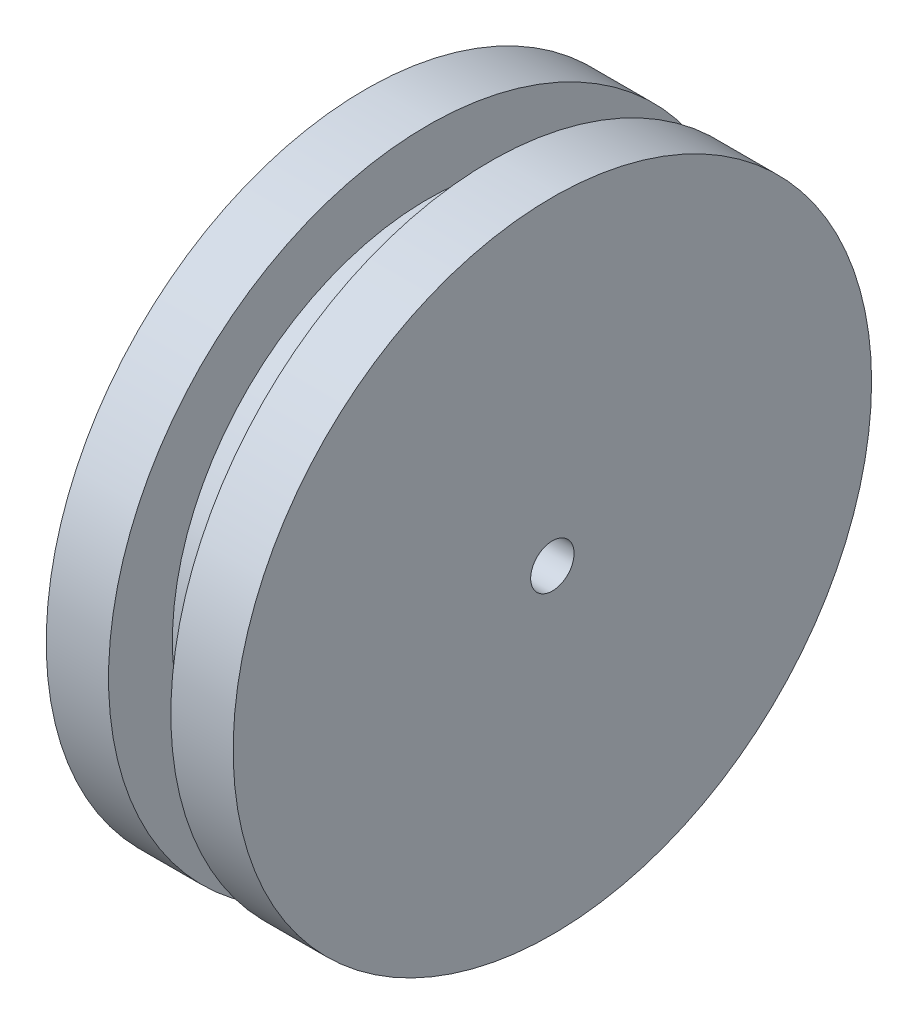
ISO-10303-21;
HEADER;
FILE_DESCRIPTION(('STEP AP214'),'2;1');
FILE_NAME('part.step','',(''),(''),'','','');
FILE_SCHEMA(('AUTOMOTIVE_DESIGN { 1 0 10303 214 1 1 1 1 }'));
ENDSEC;
DATA;
#1=APPLICATION_CONTEXT('core data for automotive mechanical design processes');
#2=APPLICATION_PROTOCOL_DEFINITION('international standard','automotive_design',2000,#1);
#3=PRODUCT_CONTEXT('',#1,'mechanical');
#4=PRODUCT('Part','Part','',(#3));
#5=PRODUCT_RELATED_PRODUCT_CATEGORY('part','',(#4));
#6=PRODUCT_DEFINITION_FORMATION('','',#4);
#7=PRODUCT_DEFINITION_CONTEXT('part definition',#1,'design');
#8=PRODUCT_DEFINITION('design','',#6,#7);
#9=PRODUCT_DEFINITION_SHAPE('','',#8);
#10=(LENGTH_UNIT() NAMED_UNIT(*) SI_UNIT(.MILLI.,.METRE.));
#11=(NAMED_UNIT(*) PLANE_ANGLE_UNIT() SI_UNIT($,.RADIAN.));
#12=(NAMED_UNIT(*) SI_UNIT($,.STERADIAN.) SOLID_ANGLE_UNIT());
#13=UNCERTAINTY_MEASURE_WITH_UNIT(LENGTH_MEASURE(1.E-05),#10,'distance_accuracy_value','');
#14=(GEOMETRIC_REPRESENTATION_CONTEXT(3) GLOBAL_UNCERTAINTY_ASSIGNED_CONTEXT((#13)) GLOBAL_UNIT_ASSIGNED_CONTEXT((#10,
#11,#12)) REPRESENTATION_CONTEXT('',''));
#15=CARTESIAN_POINT('',(0.,0.,0.));
#16=DIRECTION('',(0.,0.,1.));
#17=DIRECTION('',(1.,0.,0.));
#18=AXIS2_PLACEMENT_3D('',#15,#16,#17);
#19=CARTESIAN_POINT('',(9.2964,0.,0.));
#20=DIRECTION('',(-1.,0.,0.));
#21=DIRECTION('',(0.,0.,1.));
#22=AXIS2_PLACEMENT_3D('',#19,#20,#21);
#23=CYLINDRICAL_SURFACE('',#22,15.875);
#24=CARTESIAN_POINT('',(9.2964,0.,0.));
#25=DIRECTION('',(1.,0.,0.));
#26=DIRECTION('',(0.,0.,-1.));
#27=AXIS2_PLACEMENT_3D('',#24,#25,#26);
#28=CIRCLE('',#27,15.875);
#29=CARTESIAN_POINT('',(9.2964,0.,-15.875));
#30=VERTEX_POINT('',#29);
#31=EDGE_CURVE('E11',#30,#30,#28,.T.);
#32=ORIENTED_EDGE('',*,*,#31,.F.);
#33=EDGE_LOOP('',(#32));
#34=FACE_BOUND('',#33,.T.);
#35=CARTESIAN_POINT('',(6.1976,0.,0.));
#36=DIRECTION('',(1.,0.,0.));
#37=DIRECTION('',(0.,0.,-1.));
#38=AXIS2_PLACEMENT_3D('',#35,#36,#37);
#39=CIRCLE('',#38,15.875);
#40=CARTESIAN_POINT('',(6.1976,0.,-15.875));
#41=VERTEX_POINT('',#40);
#42=EDGE_CURVE('E47',#41,#41,#39,.T.);
#43=ORIENTED_EDGE('',*,*,#42,.T.);
#44=EDGE_LOOP('',(#43));
#45=FACE_BOUND('',#44,.T.);
#46=ADVANCED_FACE('F40',(#34,#45),#23,.T.);
#47=CARTESIAN_POINT('',(9.2964,0.,0.));
#48=DIRECTION('',(1.,0.,0.));
#49=DIRECTION('',(0.,0.,-1.));
#50=AXIS2_PLACEMENT_3D('',#47,#48,#49);
#51=PLANE('',#50);
#52=CARTESIAN_POINT('',(9.2964,0.,0.));
#53=DIRECTION('',(1.,0.,0.));
#54=DIRECTION('',(0.,0.,-1.));
#55=AXIS2_PLACEMENT_3D('',#52,#53,#54);
#56=CIRCLE('',#55,1.0795);
#57=CARTESIAN_POINT('',(9.2964,0.,-1.0795));
#58=VERTEX_POINT('',#57);
#59=EDGE_CURVE('E53',#58,#58,#56,.T.);
#60=ORIENTED_EDGE('',*,*,#59,.F.);
#61=EDGE_LOOP('',(#60));
#62=FACE_BOUND('',#61,.T.);
#63=ORIENTED_EDGE('',*,*,#31,.T.);
#64=EDGE_LOOP('',(#63));
#65=FACE_BOUND('',#64,.T.);
#66=ADVANCED_FACE('F69',(#62,#65),#51,.T.);
#67=CARTESIAN_POINT('',(6.1976,0.,0.));
#68=DIRECTION('',(1.,0.,0.));
#69=DIRECTION('',(0.,0.,-1.));
#70=AXIS2_PLACEMENT_3D('',#67,#68,#69);
#71=PLANE('',#70);
#72=CARTESIAN_POINT('',(6.1976,0.,0.));
#73=DIRECTION('',(1.,0.,0.));
#74=DIRECTION('',(0.,0.,-1.));
#75=AXIS2_PLACEMENT_3D('',#72,#73,#74);
#76=CIRCLE('',#75,1.0795);
#77=CARTESIAN_POINT('',(6.1976,0.,-1.0795));
#78=VERTEX_POINT('',#77);
#79=EDGE_CURVE('E43',#78,#78,#76,.T.);
#80=ORIENTED_EDGE('',*,*,#79,.T.);
#81=EDGE_LOOP('',(#80));
#82=FACE_BOUND('',#81,.T.);
#83=ORIENTED_EDGE('',*,*,#42,.F.);
#84=EDGE_LOOP('',(#83));
#85=FACE_BOUND('',#84,.T.);
#86=ADVANCED_FACE('F60',(#82,#85),#71,.F.);
#87=CARTESIAN_POINT('',(0.,0.,0.));
#88=DIRECTION('',(1.,0.,0.));
#89=DIRECTION('',(0.,0.,-1.));
#90=AXIS2_PLACEMENT_3D('',#87,#88,#89);
#91=CYLINDRICAL_SURFACE('',#90,1.0795);
#92=CARTESIAN_POINT('',(9.2964,0.,-1.0795));
#93=CARTESIAN_POINT('',(9.26412083333333,0.,-1.0795));
#94=CARTESIAN_POINT('',(9.23184166666666,0.,-1.0795));
#95=CARTESIAN_POINT('',(9.16728333333333,0.,-1.0795));
#96=CARTESIAN_POINT('',(9.13500416666666,0.,-1.0795));
#97=CARTESIAN_POINT('',(9.07044583333333,0.,-1.0795));
#98=CARTESIAN_POINT('',(9.03816666666667,0.,-1.0795));
#99=CARTESIAN_POINT('',(8.97360833333333,0.,-1.0795));
#100=CARTESIAN_POINT('',(8.94132916666666,0.,-1.0795));
#101=CARTESIAN_POINT('',(8.87677083333333,0.,-1.0795));
#102=CARTESIAN_POINT('',(8.84449166666666,0.,-1.0795));
#103=CARTESIAN_POINT('',(8.77993333333333,0.,-1.0795));
#104=CARTESIAN_POINT('',(8.74765416666666,0.,-1.0795));
#105=CARTESIAN_POINT('',(8.68309583333333,0.,-1.0795));
#106=CARTESIAN_POINT('',(8.65081666666666,0.,-1.0795));
#107=CARTESIAN_POINT('',(8.58625833333333,0.,-1.0795));
#108=CARTESIAN_POINT('',(8.55397916666666,0.,-1.0795));
#109=CARTESIAN_POINT('',(8.48942083333333,0.,-1.0795));
#110=CARTESIAN_POINT('',(8.45714166666667,0.,-1.0795));
#111=CARTESIAN_POINT('',(8.39258333333333,0.,-1.0795));
#112=CARTESIAN_POINT('',(8.36030416666666,0.,-1.0795));
#113=CARTESIAN_POINT('',(8.29574583333333,0.,-1.0795));
#114=CARTESIAN_POINT('',(8.26346666666666,0.,-1.0795));
#115=CARTESIAN_POINT('',(8.19890833333333,0.,-1.0795));
#116=CARTESIAN_POINT('',(8.16662916666666,0.,-1.0795));
#117=CARTESIAN_POINT('',(8.10207083333333,0.,-1.0795));
#118=CARTESIAN_POINT('',(8.06979166666666,0.,-1.0795));
#119=CARTESIAN_POINT('',(8.00523333333333,0.,-1.0795));
#120=CARTESIAN_POINT('',(7.97295416666666,0.,-1.0795));
#121=CARTESIAN_POINT('',(7.90839583333333,0.,-1.0795));
#122=CARTESIAN_POINT('',(7.87611666666666,0.,-1.0795));
#123=CARTESIAN_POINT('',(7.81155833333333,0.,-1.0795));
#124=CARTESIAN_POINT('',(7.77927916666667,0.,-1.0795));
#125=CARTESIAN_POINT('',(7.71472083333333,0.,-1.0795));
#126=CARTESIAN_POINT('',(7.68244166666667,0.,-1.0795));
#127=CARTESIAN_POINT('',(7.61788333333333,0.,-1.0795));
#128=CARTESIAN_POINT('',(7.58560416666667,0.,-1.0795));
#129=CARTESIAN_POINT('',(7.52104583333333,0.,-1.0795));
#130=CARTESIAN_POINT('',(7.48876666666667,0.,-1.0795));
#131=CARTESIAN_POINT('',(7.42420833333333,0.,-1.0795));
#132=CARTESIAN_POINT('',(7.39192916666666,0.,-1.0795));
#133=CARTESIAN_POINT('',(7.32737083333333,0.,-1.0795));
#134=CARTESIAN_POINT('',(7.29509166666667,0.,-1.0795));
#135=CARTESIAN_POINT('',(7.23053333333333,0.,-1.0795));
#136=CARTESIAN_POINT('',(7.19825416666666,0.,-1.0795));
#137=CARTESIAN_POINT('',(7.13369583333333,0.,-1.0795));
#138=CARTESIAN_POINT('',(7.10141666666667,0.,-1.0795));
#139=CARTESIAN_POINT('',(7.03685833333333,0.,-1.0795));
#140=CARTESIAN_POINT('',(7.00457916666667,0.,-1.0795));
#141=CARTESIAN_POINT('',(6.94002083333333,0.,-1.0795));
#142=CARTESIAN_POINT('',(6.90774166666666,0.,-1.0795));
#143=CARTESIAN_POINT('',(6.84318333333333,0.,-1.0795));
#144=CARTESIAN_POINT('',(6.81090416666667,0.,-1.0795));
#145=CARTESIAN_POINT('',(6.74634583333333,0.,-1.0795));
#146=CARTESIAN_POINT('',(6.71406666666667,0.,-1.0795));
#147=CARTESIAN_POINT('',(6.64950833333333,0.,-1.0795));
#148=CARTESIAN_POINT('',(6.61722916666667,0.,-1.0795));
#149=CARTESIAN_POINT('',(6.55267083333333,0.,-1.0795));
#150=CARTESIAN_POINT('',(6.52039166666667,0.,-1.0795));
#151=CARTESIAN_POINT('',(6.45583333333333,0.,-1.0795));
#152=CARTESIAN_POINT('',(6.42355416666666,0.,-1.0795));
#153=CARTESIAN_POINT('',(6.35899583333333,0.,-1.0795));
#154=CARTESIAN_POINT('',(6.32671666666667,0.,-1.0795));
#155=CARTESIAN_POINT('',(6.26215833333333,0.,-1.0795));
#156=CARTESIAN_POINT('',(6.22987916666667,0.,-1.0795));
#157=CARTESIAN_POINT('',(6.1976,0.,-1.0795));
#158=B_SPLINE_CURVE_WITH_KNOTS('',3,(#92,#93,#94,#95,#96,#97,#98,#99,#100,#101,#102,#103,#104,
#105,#106,#107,#108,#109,#110,#111,#112,#113,#114,#115,#116,#117,#118,#119,#120,#121,#122,#123,
#124,#125,#126,#127,#128,#129,#130,#131,#132,#133,#134,#135,#136,#137,#138,#139,#140,#141,#142,
#143,#144,#145,#146,#147,#148,#149,#150,#151,#152,#153,#154,#155,#156,#157),.UNSPECIFIED.,.F.,
.F.,(4,2,2,2,2,2,2,2,2,2,2,2,2,2,2,2,2,2,2,2,2,2,2,2,2,2,2,2,2,2,2,2,4),(0.,0.0968375000000004,
0.193675000000001,0.290512499999999,0.38735,0.4841875,0.581025000000001,0.677862500000001,
0.7747,0.8715375,0.968375,1.0652125,1.16205,1.2588875,1.355725,1.4525625,1.5494,1.6462375,
1.743075,1.8399125,1.93675,2.0335875,2.130425,2.2272625,2.3241,2.4209375,2.517775,2.6146125,
2.71145,2.8082875,2.905125,3.0019625,3.0988),.UNSPECIFIED.);
#159=EDGE_CURVE('BSEAM63',#58,#78,#158,.T.);
#160=ORIENTED_EDGE('',*,*,#59,.T.);
#161=ORIENTED_EDGE('',*,*,#79,.F.);
#162=ORIENTED_EDGE('',*,*,#159,.T.);
#163=ORIENTED_EDGE('',*,*,#159,.F.);
#164=EDGE_LOOP('',(#160,#162,#161,#163));
#165=FACE_BOUND('',#164,.T.);
#166=ADVANCED_FACE('F63',(#165),#91,.F.);
#167=CLOSED_SHELL('',(#46,#66,#86,#166));
#168=MANIFOLD_SOLID_BREP('B2',#167);
#169=CARTESIAN_POINT('',(6.1976,0.,0.));
#170=DIRECTION('',(-1.,0.,0.));
#171=DIRECTION('',(0.,0.,1.));
#172=AXIS2_PLACEMENT_3D('',#169,#170,#171);
#173=CYLINDRICAL_SURFACE('',#172,12.7);
#174=CARTESIAN_POINT('',(6.1976,0.,0.));
#175=DIRECTION('',(1.,0.,0.));
#176=DIRECTION('',(0.,0.,-1.));
#177=AXIS2_PLACEMENT_3D('',#174,#175,#176);
#178=CIRCLE('',#177,12.7);
#179=CARTESIAN_POINT('',(6.1976,0.,-12.7));
#180=VERTEX_POINT('',#179);
#181=EDGE_CURVE('E39',#180,#180,#178,.T.);
#182=ORIENTED_EDGE('',*,*,#181,.F.);
#183=EDGE_LOOP('',(#182));
#184=FACE_BOUND('',#183,.T.);
#185=CARTESIAN_POINT('',(3.0988,0.,0.));
#186=DIRECTION('',(1.,0.,0.));
#187=DIRECTION('',(0.,0.,-1.));
#188=AXIS2_PLACEMENT_3D('',#185,#186,#187);
#189=CIRCLE('',#188,12.7);
#190=CARTESIAN_POINT('',(3.0988,0.,-12.7));
#191=VERTEX_POINT('',#190);
#192=EDGE_CURVE('E116',#191,#191,#189,.T.);
#193=ORIENTED_EDGE('',*,*,#192,.T.);
#194=EDGE_LOOP('',(#193));
#195=FACE_BOUND('',#194,.T.);
#196=ADVANCED_FACE('F109',(#184,#195),#173,.T.);
#197=CARTESIAN_POINT('',(6.1976,0.,0.));
#198=DIRECTION('',(1.,0.,0.));
#199=DIRECTION('',(0.,0.,-1.));
#200=AXIS2_PLACEMENT_3D('',#197,#198,#199);
#201=PLANE('',#200);
#202=CARTESIAN_POINT('',(6.1976,0.,0.));
#203=DIRECTION('',(1.,0.,0.));
#204=DIRECTION('',(0.,0.,-1.));
#205=AXIS2_PLACEMENT_3D('',#202,#203,#204);
#206=CIRCLE('',#205,1.0795);
#207=CARTESIAN_POINT('',(6.1976,0.,-1.0795));
#208=VERTEX_POINT('',#207);
#209=EDGE_CURVE('E121',#208,#208,#206,.T.);
#210=ORIENTED_EDGE('',*,*,#209,.F.);
#211=EDGE_LOOP('',(#210));
#212=FACE_BOUND('',#211,.T.);
#213=ORIENTED_EDGE('',*,*,#181,.T.);
#214=EDGE_LOOP('',(#213));
#215=FACE_BOUND('',#214,.T.);
#216=ADVANCED_FACE('F138',(#212,#215),#201,.T.);
#217=CARTESIAN_POINT('',(3.0988,0.,0.));
#218=DIRECTION('',(1.,0.,0.));
#219=DIRECTION('',(0.,0.,-1.));
#220=AXIS2_PLACEMENT_3D('',#217,#218,#219);
#221=PLANE('',#220);
#222=CARTESIAN_POINT('',(3.0988,0.,0.));
#223=DIRECTION('',(1.,0.,0.));
#224=DIRECTION('',(0.,0.,-1.));
#225=AXIS2_PLACEMENT_3D('',#222,#223,#224);
#226=CIRCLE('',#225,1.0795);
#227=CARTESIAN_POINT('',(3.0988,0.,-1.0795));
#228=VERTEX_POINT('',#227);
#229=EDGE_CURVE('E112',#228,#228,#226,.T.);
#230=ORIENTED_EDGE('',*,*,#229,.T.);
#231=EDGE_LOOP('',(#230));
#232=FACE_BOUND('',#231,.T.);
#233=ORIENTED_EDGE('',*,*,#192,.F.);
#234=EDGE_LOOP('',(#233));
#235=FACE_BOUND('',#234,.T.);
#236=ADVANCED_FACE('F129',(#232,#235),#221,.F.);
#237=CARTESIAN_POINT('',(0.,0.,0.));
#238=DIRECTION('',(1.,0.,0.));
#239=DIRECTION('',(0.,0.,-1.));
#240=AXIS2_PLACEMENT_3D('',#237,#238,#239);
#241=CYLINDRICAL_SURFACE('',#240,1.0795);
#242=CARTESIAN_POINT('',(6.1976,0.,-1.0795));
#243=CARTESIAN_POINT('',(6.16532083333333,0.,-1.0795));
#244=CARTESIAN_POINT('',(6.13304166666667,0.,-1.0795));
#245=CARTESIAN_POINT('',(6.06848333333333,0.,-1.0795));
#246=CARTESIAN_POINT('',(6.03620416666667,0.,-1.0795));
#247=CARTESIAN_POINT('',(5.97164583333333,0.,-1.0795));
#248=CARTESIAN_POINT('',(5.93936666666667,0.,-1.0795));
#249=CARTESIAN_POINT('',(5.87480833333333,0.,-1.0795));
#250=CARTESIAN_POINT('',(5.84252916666667,0.,-1.0795));
#251=CARTESIAN_POINT('',(5.77797083333333,0.,-1.0795));
#252=CARTESIAN_POINT('',(5.74569166666666,0.,-1.0795));
#253=CARTESIAN_POINT('',(5.68113333333333,0.,-1.0795));
#254=CARTESIAN_POINT('',(5.64885416666666,0.,-1.0795));
#255=CARTESIAN_POINT('',(5.58429583333333,0.,-1.0795));
#256=CARTESIAN_POINT('',(5.55201666666667,0.,-1.0795));
#257=CARTESIAN_POINT('',(5.48745833333333,0.,-1.0795));
#258=CARTESIAN_POINT('',(5.45517916666666,0.,-1.0795));
#259=CARTESIAN_POINT('',(5.39062083333333,0.,-1.0795));
#260=CARTESIAN_POINT('',(5.35834166666667,0.,-1.0795));
#261=CARTESIAN_POINT('',(5.29378333333333,0.,-1.0795));
#262=CARTESIAN_POINT('',(5.26150416666666,0.,-1.0795));
#263=CARTESIAN_POINT('',(5.19694583333333,0.,-1.0795));
#264=CARTESIAN_POINT('',(5.16466666666667,0.,-1.0795));
#265=CARTESIAN_POINT('',(5.10010833333333,0.,-1.0795));
#266=CARTESIAN_POINT('',(5.06782916666667,0.,-1.0795));
#267=CARTESIAN_POINT('',(5.00327083333333,0.,-1.0795));
#268=CARTESIAN_POINT('',(4.97099166666667,0.,-1.0795));
#269=CARTESIAN_POINT('',(4.90643333333333,0.,-1.0795));
#270=CARTESIAN_POINT('',(4.87415416666667,0.,-1.0795));
#271=CARTESIAN_POINT('',(4.80959583333333,0.,-1.0795));
#272=CARTESIAN_POINT('',(4.77731666666666,0.,-1.0795));
#273=CARTESIAN_POINT('',(4.71275833333333,0.,-1.0795));
#274=CARTESIAN_POINT('',(4.68047916666667,0.,-1.0795));
#275=CARTESIAN_POINT('',(4.61592083333333,0.,-1.0795));
#276=CARTESIAN_POINT('',(4.58364166666667,0.,-1.0795));
#277=CARTESIAN_POINT('',(4.51908333333333,0.,-1.0795));
#278=CARTESIAN_POINT('',(4.48680416666667,0.,-1.0795));
#279=CARTESIAN_POINT('',(4.42224583333333,0.,-1.0795));
#280=CARTESIAN_POINT('',(4.38996666666667,0.,-1.0795));
#281=CARTESIAN_POINT('',(4.32540833333333,0.,-1.0795));
#282=CARTESIAN_POINT('',(4.29312916666667,0.,-1.0795));
#283=CARTESIAN_POINT('',(4.22857083333333,0.,-1.0795));
#284=CARTESIAN_POINT('',(4.19629166666667,0.,-1.0795));
#285=CARTESIAN_POINT('',(4.13173333333333,0.,-1.0795));
#286=CARTESIAN_POINT('',(4.09945416666667,0.,-1.0795));
#287=CARTESIAN_POINT('',(4.03489583333333,0.,-1.0795));
#288=CARTESIAN_POINT('',(4.00261666666666,0.,-1.0795));
#289=CARTESIAN_POINT('',(3.93805833333333,0.,-1.0795));
#290=CARTESIAN_POINT('',(3.90577916666667,0.,-1.0795));
#291=CARTESIAN_POINT('',(3.84122083333333,0.,-1.0795));
#292=CARTESIAN_POINT('',(3.80894166666667,0.,-1.0795));
#293=CARTESIAN_POINT('',(3.74438333333333,0.,-1.0795));
#294=CARTESIAN_POINT('',(3.71210416666667,0.,-1.0795));
#295=CARTESIAN_POINT('',(3.64754583333333,0.,-1.0795));
#296=CARTESIAN_POINT('',(3.61526666666667,0.,-1.0795));
#297=CARTESIAN_POINT('',(3.55070833333333,0.,-1.0795));
#298=CARTESIAN_POINT('',(3.51842916666667,0.,-1.0795));
#299=CARTESIAN_POINT('',(3.45387083333333,0.,-1.0795));
#300=CARTESIAN_POINT('',(3.42159166666667,0.,-1.0795));
#301=CARTESIAN_POINT('',(3.35703333333333,0.,-1.0795));
#302=CARTESIAN_POINT('',(3.32475416666667,0.,-1.0795));
#303=CARTESIAN_POINT('',(3.26019583333333,0.,-1.0795));
#304=CARTESIAN_POINT('',(3.22791666666667,0.,-1.0795));
#305=CARTESIAN_POINT('',(3.16335833333333,0.,-1.0795));
#306=CARTESIAN_POINT('',(3.13107916666667,0.,-1.0795));
#307=CARTESIAN_POINT('',(3.0988,0.,-1.0795));
#308=B_SPLINE_CURVE_WITH_KNOTS('',3,(#242,#243,#244,#245,#246,#247,#248,#249,#250,#251,#252,
#253,#254,#255,#256,#257,#258,#259,#260,#261,#262,#263,#264,#265,#266,#267,#268,#269,#270,#271,
#272,#273,#274,#275,#276,#277,#278,#279,#280,#281,#282,#283,#284,#285,#286,#287,#288,#289,#290,
#291,#292,#293,#294,#295,#296,#297,#298,#299,#300,#301,#302,#303,#304,#305,#306,#307),
.UNSPECIFIED.,.F.,.F.,(4,2,2,2,2,2,2,2,2,2,2,2,2,2,2,2,2,2,2,2,2,2,2,2,2,2,2,2,2,2,2,2,4),(0.,
0.0968375000000004,0.193675,0.2905125,0.38735,0.4841875,0.581025,0.6778625,0.7747,0.8715375,
0.968375,1.0652125,1.16205,1.2588875,1.355725,1.4525625,1.5494,1.6462375,1.743075,1.8399125,
1.93675,2.0335875,2.130425,2.2272625,2.3241,2.4209375,2.517775,2.6146125,2.71145,2.8082875,
2.905125,3.0019625,3.0988),.UNSPECIFIED.);
#309=EDGE_CURVE('BSEAM132',#208,#228,#308,.T.);
#310=ORIENTED_EDGE('',*,*,#209,.T.);
#311=ORIENTED_EDGE('',*,*,#229,.F.);
#312=ORIENTED_EDGE('',*,*,#309,.T.);
#313=ORIENTED_EDGE('',*,*,#309,.F.);
#314=EDGE_LOOP('',(#310,#312,#311,#313));
#315=FACE_BOUND('',#314,.T.);
#316=ADVANCED_FACE('F132',(#315),#241,.F.);
#317=CLOSED_SHELL('',(#196,#216,#236,#316));
#318=MANIFOLD_SOLID_BREP('B6',#317);
#319=CARTESIAN_POINT('',(3.0988,0.,0.));
#320=DIRECTION('',(-1.,0.,0.));
#321=DIRECTION('',(0.,0.,1.));
#322=AXIS2_PLACEMENT_3D('',#319,#320,#321);
#323=CYLINDRICAL_SURFACE('',#322,15.875);
#324=CARTESIAN_POINT('',(3.0988,0.,0.));
#325=DIRECTION('',(1.,0.,0.));
#326=DIRECTION('',(0.,0.,-1.));
#327=AXIS2_PLACEMENT_3D('',#324,#325,#326);
#328=CIRCLE('',#327,15.875);
#329=CARTESIAN_POINT('',(3.0988,0.,-15.875));
#330=VERTEX_POINT('',#329);
#331=EDGE_CURVE('E108',#330,#330,#328,.T.);
#332=ORIENTED_EDGE('',*,*,#331,.F.);
#333=EDGE_LOOP('',(#332));
#334=FACE_BOUND('',#333,.T.);
#335=CARTESIAN_POINT('',(0.,0.,0.));
#336=DIRECTION('',(1.,0.,0.));
#337=DIRECTION('',(0.,0.,-1.));
#338=AXIS2_PLACEMENT_3D('',#335,#336,#337);
#339=CIRCLE('',#338,15.875);
#340=CARTESIAN_POINT('',(0.,0.,-15.875));
#341=VERTEX_POINT('',#340);
#342=EDGE_CURVE('E174',#341,#341,#339,.T.);
#343=ORIENTED_EDGE('',*,*,#342,.T.);
#344=EDGE_LOOP('',(#343));
#345=FACE_BOUND('',#344,.T.);
#346=ADVANCED_FACE('F171',(#334,#345),#323,.T.);
#347=CARTESIAN_POINT('',(3.0988,0.,0.));
#348=DIRECTION('',(1.,0.,0.));
#349=DIRECTION('',(0.,0.,-1.));
#350=AXIS2_PLACEMENT_3D('',#347,#348,#349);
#351=PLANE('',#350);
#352=CARTESIAN_POINT('',(3.0988,0.,0.));
#353=DIRECTION('',(1.,0.,0.));
#354=DIRECTION('',(0.,0.,-1.));
#355=AXIS2_PLACEMENT_3D('',#352,#353,#354);
#356=CIRCLE('',#355,1.0795);
#357=CARTESIAN_POINT('',(3.0988,0.,-1.0795));
#358=VERTEX_POINT('',#357);
#359=EDGE_CURVE('E181',#358,#358,#356,.T.);
#360=ORIENTED_EDGE('',*,*,#359,.F.);
#361=EDGE_LOOP('',(#360));
#362=FACE_BOUND('',#361,.T.);
#363=ORIENTED_EDGE('',*,*,#331,.T.);
#364=EDGE_LOOP('',(#363));
#365=FACE_BOUND('',#364,.T.);
#366=ADVANCED_FACE('F199',(#362,#365),#351,.T.);
#367=CARTESIAN_POINT('',(0.,0.,0.));
#368=DIRECTION('',(1.,0.,0.));
#369=DIRECTION('',(0.,0.,-1.));
#370=AXIS2_PLACEMENT_3D('',#367,#368,#369);
#371=PLANE('',#370);
#372=CARTESIAN_POINT('',(0.,0.,0.));
#373=DIRECTION('',(1.,0.,0.));
#374=DIRECTION('',(0.,0.,-1.));
#375=AXIS2_PLACEMENT_3D('',#372,#373,#374);
#376=CIRCLE('',#375,1.0795);
#377=CARTESIAN_POINT('',(0.,0.,-1.0795));
#378=VERTEX_POINT('',#377);
#379=EDGE_CURVE('E185',#378,#378,#376,.T.);
#380=ORIENTED_EDGE('',*,*,#379,.T.);
#381=EDGE_LOOP('',(#380));
#382=FACE_BOUND('',#381,.T.);
#383=ORIENTED_EDGE('',*,*,#342,.F.);
#384=EDGE_LOOP('',(#383));
#385=FACE_BOUND('',#384,.T.);
#386=ADVANCED_FACE('F189',(#382,#385),#371,.F.);
#387=CARTESIAN_POINT('',(0.,0.,0.));
#388=DIRECTION('',(1.,0.,0.));
#389=DIRECTION('',(0.,0.,-1.));
#390=AXIS2_PLACEMENT_3D('',#387,#388,#389);
#391=CYLINDRICAL_SURFACE('',#390,1.0795);
#392=CARTESIAN_POINT('',(3.0988,0.,-1.0795));
#393=CARTESIAN_POINT('',(3.06652083333333,0.,-1.0795));
#394=CARTESIAN_POINT('',(3.03424166666667,0.,-1.0795));
#395=CARTESIAN_POINT('',(2.96968333333333,0.,-1.0795));
#396=CARTESIAN_POINT('',(2.93740416666667,0.,-1.0795));
#397=CARTESIAN_POINT('',(2.87284583333333,0.,-1.0795));
#398=CARTESIAN_POINT('',(2.84056666666667,0.,-1.0795));
#399=CARTESIAN_POINT('',(2.77600833333333,0.,-1.0795));
#400=CARTESIAN_POINT('',(2.74372916666667,0.,-1.0795));
#401=CARTESIAN_POINT('',(2.67917083333333,0.,-1.0795));
#402=CARTESIAN_POINT('',(2.64689166666667,0.,-1.0795));
#403=CARTESIAN_POINT('',(2.58233333333333,0.,-1.0795));
#404=CARTESIAN_POINT('',(2.55005416666667,0.,-1.0795));
#405=CARTESIAN_POINT('',(2.48549583333333,0.,-1.0795));
#406=CARTESIAN_POINT('',(2.45321666666667,0.,-1.0795));
#407=CARTESIAN_POINT('',(2.38865833333333,0.,-1.0795));
#408=CARTESIAN_POINT('',(2.35637916666667,0.,-1.0795));
#409=CARTESIAN_POINT('',(2.29182083333333,0.,-1.0795));
#410=CARTESIAN_POINT('',(2.25954166666667,0.,-1.0795));
#411=CARTESIAN_POINT('',(2.19498333333333,0.,-1.0795));
#412=CARTESIAN_POINT('',(2.16270416666667,0.,-1.0795));
#413=CARTESIAN_POINT('',(2.09814583333333,0.,-1.0795));
#414=CARTESIAN_POINT('',(2.06586666666667,0.,-1.0795));
#415=CARTESIAN_POINT('',(2.00130833333333,0.,-1.0795));
#416=CARTESIAN_POINT('',(1.96902916666667,0.,-1.0795));
#417=CARTESIAN_POINT('',(1.90447083333333,0.,-1.0795));
#418=CARTESIAN_POINT('',(1.87219166666667,0.,-1.0795));
#419=CARTESIAN_POINT('',(1.80763333333333,0.,-1.0795));
#420=CARTESIAN_POINT('',(1.77535416666667,0.,-1.0795));
#421=CARTESIAN_POINT('',(1.71079583333333,0.,-1.0795));
#422=CARTESIAN_POINT('',(1.67851666666667,0.,-1.0795));
#423=CARTESIAN_POINT('',(1.61395833333333,0.,-1.0795));
#424=CARTESIAN_POINT('',(1.58167916666667,0.,-1.0795));
#425=CARTESIAN_POINT('',(1.51712083333333,0.,-1.0795));
#426=CARTESIAN_POINT('',(1.48484166666667,0.,-1.0795));
#427=CARTESIAN_POINT('',(1.42028333333333,0.,-1.0795));
#428=CARTESIAN_POINT('',(1.38800416666667,0.,-1.0795));
#429=CARTESIAN_POINT('',(1.32344583333333,0.,-1.0795));
#430=CARTESIAN_POINT('',(1.29116666666667,0.,-1.0795));
#431=CARTESIAN_POINT('',(1.22660833333333,0.,-1.0795));
#432=CARTESIAN_POINT('',(1.19432916666667,0.,-1.0795));
#433=CARTESIAN_POINT('',(1.12977083333333,0.,-1.0795));
#434=CARTESIAN_POINT('',(1.09749166666667,0.,-1.0795));
#435=CARTESIAN_POINT('',(1.03293333333333,0.,-1.0795));
#436=CARTESIAN_POINT('',(1.00065416666667,0.,-1.0795));
#437=CARTESIAN_POINT('',(0.936095833333333,0.,-1.0795));
#438=CARTESIAN_POINT('',(0.903816666666667,0.,-1.0795));
#439=CARTESIAN_POINT('',(0.839258333333333,0.,-1.0795));
#440=CARTESIAN_POINT('',(0.806979166666666,0.,-1.0795));
#441=CARTESIAN_POINT('',(0.742420833333333,0.,-1.0795));
#442=CARTESIAN_POINT('',(0.710141666666666,0.,-1.0795));
#443=CARTESIAN_POINT('',(0.645583333333333,0.,-1.0795));
#444=CARTESIAN_POINT('',(0.613304166666666,0.,-1.0795));
#445=CARTESIAN_POINT('',(0.548745833333333,0.,-1.0795));
#446=CARTESIAN_POINT('',(0.516466666666666,0.,-1.0795));
#447=CARTESIAN_POINT('',(0.451908333333333,0.,-1.0795));
#448=CARTESIAN_POINT('',(0.419629166666666,0.,-1.0795));
#449=CARTESIAN_POINT('',(0.355070833333333,0.,-1.0795));
#450=CARTESIAN_POINT('',(0.322791666666666,0.,-1.0795));
#451=CARTESIAN_POINT('',(0.258233333333333,0.,-1.0795));
#452=CARTESIAN_POINT('',(0.225954166666667,0.,-1.0795));
#453=CARTESIAN_POINT('',(0.161395833333333,0.,-1.0795));
#454=CARTESIAN_POINT('',(0.129116666666667,0.,-1.0795));
#455=CARTESIAN_POINT('',(0.0645583333333333,0.,-1.0795));
#456=CARTESIAN_POINT('',(0.0322791666666666,0.,-1.0795));
#457=CARTESIAN_POINT('',(0.,0.,-1.0795));
#458=B_SPLINE_CURVE_WITH_KNOTS('',3,(#392,#393,#394,#395,#396,#397,#398,#399,#400,#401,#402,
#403,#404,#405,#406,#407,#408,#409,#410,#411,#412,#413,#414,#415,#416,#417,#418,#419,#420,#421,
#422,#423,#424,#425,#426,#427,#428,#429,#430,#431,#432,#433,#434,#435,#436,#437,#438,#439,#440,
#441,#442,#443,#444,#445,#446,#447,#448,#449,#450,#451,#452,#453,#454,#455,#456,#457),
.UNSPECIFIED.,.F.,.F.,(4,2,2,2,2,2,2,2,2,2,2,2,2,2,2,2,2,2,2,2,2,2,2,2,2,2,2,2,2,2,2,2,4),(0.,
0.0968375,0.193675,0.2905125,0.38735,0.4841875,0.581025,0.6778625,0.7747,0.8715375,0.968375,
1.0652125,1.16205,1.2588875,1.355725,1.4525625,1.5494,1.6462375,1.743075,1.8399125,1.93675,
2.0335875,2.130425,2.2272625,2.3241,2.4209375,2.517775,2.6146125,2.71145,2.8082875,2.905125,
3.0019625,3.0988),.UNSPECIFIED.);
#459=EDGE_CURVE('BSEAM192',#358,#378,#458,.T.);
#460=ORIENTED_EDGE('',*,*,#359,.T.);
#461=ORIENTED_EDGE('',*,*,#379,.F.);
#462=ORIENTED_EDGE('',*,*,#459,.T.);
#463=ORIENTED_EDGE('',*,*,#459,.F.);
#464=EDGE_LOOP('',(#460,#462,#461,#463));
#465=FACE_BOUND('',#464,.T.);
#466=ADVANCED_FACE('F192',(#465),#391,.F.);
#467=CLOSED_SHELL('',(#346,#366,#386,#466));
#468=MANIFOLD_SOLID_BREP('B34',#467);
#469=ADVANCED_BREP_SHAPE_REPRESENTATION('',(#18,#168,#318,#468),#14);
#470=SHAPE_DEFINITION_REPRESENTATION(#9,#469);
ENDSEC;
END-ISO-10303-21;
